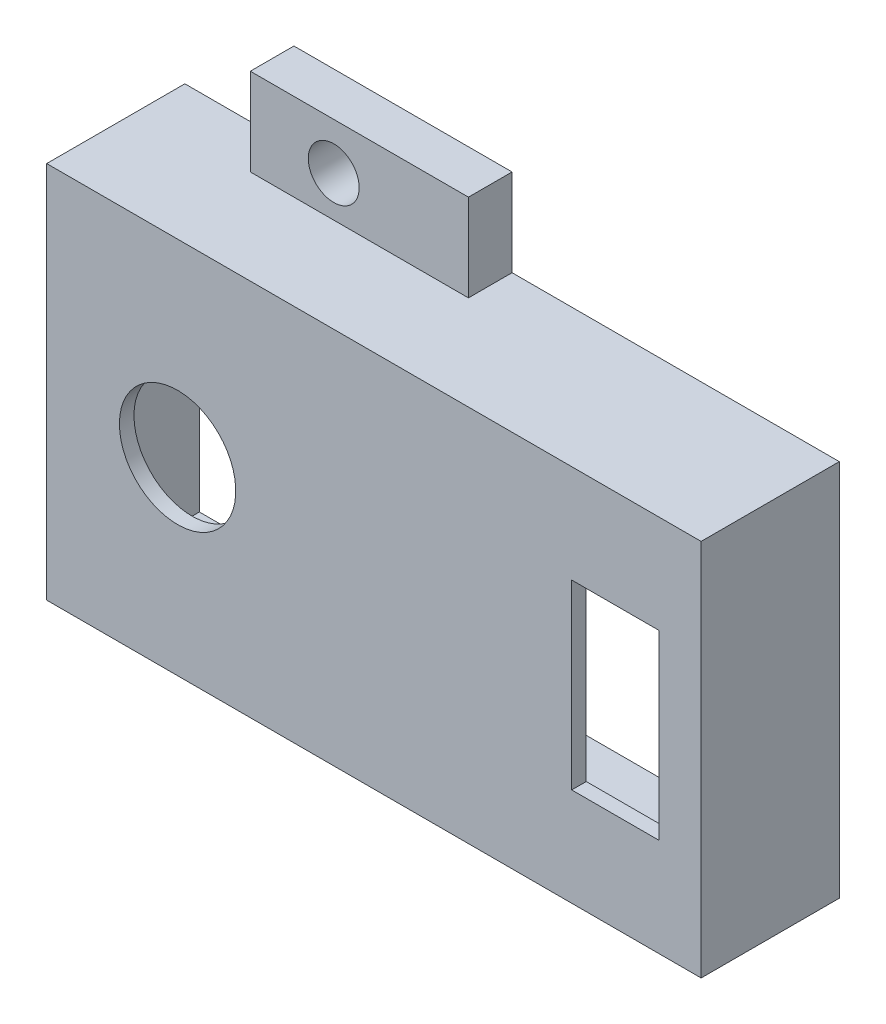
ISO-10303-21;
HEADER;
FILE_DESCRIPTION(('STEP AP214'),'2;1');
FILE_NAME('part.step','',(''),(''),'','','');
FILE_SCHEMA(('AUTOMOTIVE_DESIGN { 1 0 10303 214 1 1 1 1 }'));
ENDSEC;
DATA;
#1=APPLICATION_CONTEXT('core data for automotive mechanical design processes');
#2=APPLICATION_PROTOCOL_DEFINITION('international standard','automotive_design',2000,#1);
#3=PRODUCT_CONTEXT('',#1,'mechanical');
#4=PRODUCT('Part','Part','',(#3));
#5=PRODUCT_RELATED_PRODUCT_CATEGORY('part','',(#4));
#6=PRODUCT_DEFINITION_FORMATION('','',#4);
#7=PRODUCT_DEFINITION_CONTEXT('part definition',#1,'design');
#8=PRODUCT_DEFINITION('design','',#6,#7);
#9=PRODUCT_DEFINITION_SHAPE('','',#8);
#10=(LENGTH_UNIT() NAMED_UNIT(*) SI_UNIT(.MILLI.,.METRE.));
#11=(NAMED_UNIT(*) PLANE_ANGLE_UNIT() SI_UNIT($,.RADIAN.));
#12=(NAMED_UNIT(*) SI_UNIT($,.STERADIAN.) SOLID_ANGLE_UNIT());
#13=UNCERTAINTY_MEASURE_WITH_UNIT(LENGTH_MEASURE(1.E-05),#10,'distance_accuracy_value','');
#14=(GEOMETRIC_REPRESENTATION_CONTEXT(3) GLOBAL_UNCERTAINTY_ASSIGNED_CONTEXT((#13)) GLOBAL_UNIT_ASSIGNED_CONTEXT((#10,
#11,#12)) REPRESENTATION_CONTEXT('',''));
#15=CARTESIAN_POINT('',(0.,0.,0.));
#16=DIRECTION('',(0.,0.,1.));
#17=DIRECTION('',(1.,0.,0.));
#18=AXIS2_PLACEMENT_3D('',#15,#16,#17);
#19=CARTESIAN_POINT('',(-22.5,-13.,9.5));
#20=DIRECTION('',(0.,1.,0.));
#21=DIRECTION('',(0.,0.,1.));
#22=AXIS2_PLACEMENT_3D('',#19,#20,#21);
#23=PLANE('',#22);
#24=DIRECTION('',(0.,0.,-1.));
#25=VECTOR('',#24,1.);
#26=CARTESIAN_POINT('',(-15.,-13.,3.));
#27=LINE('',#26,#25);
#28=CARTESIAN_POINT('',(-15.,-13.,3.));
#29=VERTEX_POINT('',#28);
#30=CARTESIAN_POINT('',(-15.,-13.,0.));
#31=VERTEX_POINT('',#30);
#32=EDGE_CURVE('E220',#29,#31,#27,.T.);
#33=ORIENTED_EDGE('',*,*,#32,.F.);
#34=DIRECTION('',(1.,0.,0.));
#35=VECTOR('',#34,1.);
#36=CARTESIAN_POINT('',(0.,-13.,3.));
#37=LINE('',#36,#35);
#38=CARTESIAN_POINT('',(0.,-13.,3.));
#39=VERTEX_POINT('',#38);
#40=EDGE_CURVE('E185',#29,#39,#37,.T.);
#41=ORIENTED_EDGE('',*,*,#40,.T.);
#42=DIRECTION('',(0.,0.,-1.));
#43=VECTOR('',#42,1.);
#44=CARTESIAN_POINT('',(0.,-13.,3.));
#45=LINE('',#44,#43);
#46=CARTESIAN_POINT('',(0.,-13.,0.));
#47=VERTEX_POINT('',#46);
#48=EDGE_CURVE('E198',#39,#47,#45,.T.);
#49=ORIENTED_EDGE('',*,*,#48,.T.);
#50=DIRECTION('',(1.,0.,0.));
#51=VECTOR('',#50,1.);
#52=CARTESIAN_POINT('',(-22.5,-13.,0.));
#53=LINE('',#52,#51);
#54=CARTESIAN_POINT('',(22.5,-13.,0.));
#55=VERTEX_POINT('',#54);
#56=EDGE_CURVE('E384',#47,#55,#53,.T.);
#57=ORIENTED_EDGE('',*,*,#56,.T.);
#58=DIRECTION('',(0.,0.,-1.));
#59=VECTOR('',#58,1.);
#60=CARTESIAN_POINT('',(22.5,-13.,9.5));
#61=LINE('',#60,#59);
#62=CARTESIAN_POINT('',(22.5,-13.,9.5));
#63=VERTEX_POINT('',#62);
#64=EDGE_CURVE('E372',#63,#55,#61,.T.);
#65=ORIENTED_EDGE('',*,*,#64,.F.);
#66=DIRECTION('',(1.,0.,0.));
#67=VECTOR('',#66,1.);
#68=CARTESIAN_POINT('',(-22.5,-13.,9.5));
#69=LINE('',#68,#67);
#70=CARTESIAN_POINT('',(-22.5,-13.,9.5));
#71=VERTEX_POINT('',#70);
#72=EDGE_CURVE('E369',#71,#63,#69,.T.);
#73=ORIENTED_EDGE('',*,*,#72,.F.);
#74=DIRECTION('',(0.,0.,-1.));
#75=VECTOR('',#74,1.);
#76=CARTESIAN_POINT('',(-22.5,-13.,9.5));
#77=LINE('',#76,#75);
#78=CARTESIAN_POINT('',(-22.5,-13.,0.));
#79=VERTEX_POINT('',#78);
#80=EDGE_CURVE('E391',#71,#79,#77,.T.);
#81=ORIENTED_EDGE('',*,*,#80,.T.);
#82=EDGE_CURVE('E363',#79,#31,#53,.T.);
#83=ORIENTED_EDGE('',*,*,#82,.T.);
#84=EDGE_LOOP('',(#33,#41,#49,#57,#65,#73,#81,#83));
#85=FACE_BOUND('',#84,.T.);
#86=ADVANCED_FACE('F38',(#85),#23,.F.);
#87=CARTESIAN_POINT('',(-22.5,13.,9.5));
#88=DIRECTION('',(0.,-1.,0.));
#89=DIRECTION('',(0.,0.,-1.));
#90=AXIS2_PLACEMENT_3D('',#87,#88,#89);
#91=PLANE('',#90);
#92=DIRECTION('',(0.,0.,-1.));
#93=VECTOR('',#92,1.);
#94=CARTESIAN_POINT('',(0.,13.,3.));
#95=LINE('',#94,#93);
#96=CARTESIAN_POINT('',(0.,13.,3.));
#97=VERTEX_POINT('',#96);
#98=CARTESIAN_POINT('',(0.,13.,0.));
#99=VERTEX_POINT('',#98);
#100=EDGE_CURVE('E242',#97,#99,#95,.T.);
#101=ORIENTED_EDGE('',*,*,#100,.F.);
#102=DIRECTION('',(-1.,0.,0.));
#103=VECTOR('',#102,1.);
#104=CARTESIAN_POINT('',(0.,13.,3.));
#105=LINE('',#104,#103);
#106=CARTESIAN_POINT('',(-15.,13.,3.));
#107=VERTEX_POINT('',#106);
#108=EDGE_CURVE('E229',#97,#107,#105,.T.);
#109=ORIENTED_EDGE('',*,*,#108,.T.);
#110=DIRECTION('',(0.,0.,-1.));
#111=VECTOR('',#110,1.);
#112=CARTESIAN_POINT('',(-15.,13.,3.));
#113=LINE('',#112,#111);
#114=CARTESIAN_POINT('',(-15.,13.,0.));
#115=VERTEX_POINT('',#114);
#116=EDGE_CURVE('E258',#107,#115,#113,.T.);
#117=ORIENTED_EDGE('',*,*,#116,.T.);
#118=DIRECTION('',(-1.,0.,0.));
#119=VECTOR('',#118,1.);
#120=CARTESIAN_POINT('',(-22.5,13.,0.));
#121=LINE('',#120,#119);
#122=CARTESIAN_POINT('',(-22.5,13.,0.));
#123=VERTEX_POINT('',#122);
#124=EDGE_CURVE('E376',#115,#123,#121,.T.);
#125=ORIENTED_EDGE('',*,*,#124,.T.);
#126=DIRECTION('',(0.,0.,-1.));
#127=VECTOR('',#126,1.);
#128=CARTESIAN_POINT('',(-22.5,13.,9.5));
#129=LINE('',#128,#127);
#130=CARTESIAN_POINT('',(-22.5,13.,9.5));
#131=VERTEX_POINT('',#130);
#132=EDGE_CURVE('E47',#131,#123,#129,.T.);
#133=ORIENTED_EDGE('',*,*,#132,.F.);
#134=DIRECTION('',(-1.,0.,0.));
#135=VECTOR('',#134,1.);
#136=CARTESIAN_POINT('',(-22.5,13.,9.5));
#137=LINE('',#136,#135);
#138=CARTESIAN_POINT('',(22.5,13.,9.5));
#139=VERTEX_POINT('',#138);
#140=EDGE_CURVE('E362',#139,#131,#137,.T.);
#141=ORIENTED_EDGE('',*,*,#140,.F.);
#142=DIRECTION('',(0.,0.,-1.));
#143=VECTOR('',#142,1.);
#144=CARTESIAN_POINT('',(22.5,13.,9.5));
#145=LINE('',#144,#143);
#146=CARTESIAN_POINT('',(22.5,13.,0.));
#147=VERTEX_POINT('',#146);
#148=EDGE_CURVE('E11',#139,#147,#145,.T.);
#149=ORIENTED_EDGE('',*,*,#148,.T.);
#150=EDGE_CURVE('E377',#147,#99,#121,.T.);
#151=ORIENTED_EDGE('',*,*,#150,.T.);
#152=EDGE_LOOP('',(#101,#109,#117,#125,#133,#141,#149,#151));
#153=FACE_BOUND('',#152,.T.);
#154=ADVANCED_FACE('F419',(#153),#91,.F.);
#155=CARTESIAN_POINT('',(0.,0.,0.));
#156=DIRECTION('',(0.,0.,-1.));
#157=DIRECTION('',(-1.,0.,0.));
#158=AXIS2_PLACEMENT_3D('',#155,#156,#157);
#159=PLANE('',#158);
#160=CARTESIAN_POINT('',(-9.26271023683527,15.798173241126,0.));
#161=DIRECTION('',(0.,0.,-1.));
#162=DIRECTION('',(-1.,0.,0.));
#163=AXIS2_PLACEMENT_3D('',#160,#161,#162);
#164=CIRCLE('',#163,1.75);
#165=CARTESIAN_POINT('',(-11.0127102368353,15.798173241126,0.));
#166=VERTEX_POINT('',#165);
#167=EDGE_CURVE('E470',#166,#166,#164,.T.);
#168=ORIENTED_EDGE('',*,*,#167,.F.);
#169=EDGE_LOOP('',(#168));
#170=FACE_BOUND('',#169,.T.);
#171=CARTESIAN_POINT('',(-8.67425342470182,-16.2125602113306,0.));
#172=DIRECTION('',(0.,0.,-1.));
#173=DIRECTION('',(-1.,0.,0.));
#174=AXIS2_PLACEMENT_3D('',#171,#172,#173);
#175=CIRCLE('',#174,1.6);
#176=CARTESIAN_POINT('',(-10.2742534247018,-16.2125602113306,0.));
#177=VERTEX_POINT('',#176);
#178=EDGE_CURVE('E206',#177,#177,#175,.T.);
#179=ORIENTED_EDGE('',*,*,#178,.F.);
#180=EDGE_LOOP('',(#179));
#181=FACE_BOUND('',#180,.T.);
#182=DIRECTION('',(0.,1.,0.));
#183=VECTOR('',#182,1.);
#184=CARTESIAN_POINT('',(22.5,-13.,0.));
#185=LINE('',#184,#183);
#186=EDGE_CURVE('E319',#55,#147,#185,.T.);
#187=ORIENTED_EDGE('',*,*,#186,.F.);
#188=ORIENTED_EDGE('',*,*,#56,.F.);
#189=DIRECTION('',(0.,-1.,0.));
#190=VECTOR('',#189,1.);
#191=CARTESIAN_POINT('',(0.,-13.,0.));
#192=LINE('',#191,#190);
#193=CARTESIAN_POINT('',(0.,-19.,0.));
#194=VERTEX_POINT('',#193);
#195=EDGE_CURVE('E54',#47,#194,#192,.T.);
#196=ORIENTED_EDGE('',*,*,#195,.T.);
#197=DIRECTION('',(-1.,0.,0.));
#198=VECTOR('',#197,1.);
#199=CARTESIAN_POINT('',(0.,-19.,0.));
#200=LINE('',#199,#198);
#201=CARTESIAN_POINT('',(-15.,-19.,0.));
#202=VERTEX_POINT('',#201);
#203=EDGE_CURVE('E181',#194,#202,#200,.T.);
#204=ORIENTED_EDGE('',*,*,#203,.T.);
#205=DIRECTION('',(0.,1.,0.));
#206=VECTOR('',#205,1.);
#207=CARTESIAN_POINT('',(-15.,-13.,0.));
#208=LINE('',#207,#206);
#209=EDGE_CURVE('E200',#202,#31,#208,.T.);
#210=ORIENTED_EDGE('',*,*,#209,.T.);
#211=ORIENTED_EDGE('',*,*,#82,.F.);
#212=DIRECTION('',(0.,-1.,0.));
#213=VECTOR('',#212,1.);
#214=CARTESIAN_POINT('',(-22.5,-13.,0.));
#215=LINE('',#214,#213);
#216=EDGE_CURVE('E381',#123,#79,#215,.T.);
#217=ORIENTED_EDGE('',*,*,#216,.F.);
#218=ORIENTED_EDGE('',*,*,#124,.F.);
#219=DIRECTION('',(0.,1.,0.));
#220=VECTOR('',#219,1.);
#221=CARTESIAN_POINT('',(-15.,13.,0.));
#222=LINE('',#221,#220);
#223=CARTESIAN_POINT('',(-15.,19.,0.));
#224=VERTEX_POINT('',#223);
#225=EDGE_CURVE('E62',#115,#224,#222,.T.);
#226=ORIENTED_EDGE('',*,*,#225,.T.);
#227=DIRECTION('',(1.,0.,0.));
#228=VECTOR('',#227,1.);
#229=CARTESIAN_POINT('',(0.,19.,0.));
#230=LINE('',#229,#228);
#231=CARTESIAN_POINT('',(0.,19.,0.));
#232=VERTEX_POINT('',#231);
#233=EDGE_CURVE('E230',#224,#232,#230,.T.);
#234=ORIENTED_EDGE('',*,*,#233,.T.);
#235=DIRECTION('',(0.,-1.,0.));
#236=VECTOR('',#235,1.);
#237=CARTESIAN_POINT('',(0.,13.,0.));
#238=LINE('',#237,#236);
#239=EDGE_CURVE('E219',#232,#99,#238,.T.);
#240=ORIENTED_EDGE('',*,*,#239,.T.);
#241=ORIENTED_EDGE('',*,*,#150,.F.);
#242=EDGE_LOOP('',(#187,#188,#196,#204,#210,#211,#217,#218,#226,#234,#240,#241));
#243=FACE_BOUND('',#242,.T.);
#244=DIRECTION('',(1.,0.,0.));
#245=VECTOR('',#244,1.);
#246=CARTESIAN_POINT('',(0.,-12.,0.));
#247=LINE('',#246,#245);
#248=CARTESIAN_POINT('',(-21.5,-12.,0.));
#249=VERTEX_POINT('',#248);
#250=CARTESIAN_POINT('',(21.5,-12.,0.));
#251=VERTEX_POINT('',#250);
#252=EDGE_CURVE('E326',#249,#251,#247,.T.);
#253=ORIENTED_EDGE('',*,*,#252,.T.);
#254=DIRECTION('',(0.,1.,0.));
#255=VECTOR('',#254,1.);
#256=CARTESIAN_POINT('',(21.5,0.,0.));
#257=LINE('',#256,#255);
#258=CARTESIAN_POINT('',(21.5,12.,0.));
#259=VERTEX_POINT('',#258);
#260=EDGE_CURVE('E314',#251,#259,#257,.T.);
#261=ORIENTED_EDGE('',*,*,#260,.T.);
#262=DIRECTION('',(-1.,0.,0.));
#263=VECTOR('',#262,1.);
#264=CARTESIAN_POINT('',(0.,12.,0.));
#265=LINE('',#264,#263);
#266=CARTESIAN_POINT('',(-21.5,12.,0.));
#267=VERTEX_POINT('',#266);
#268=EDGE_CURVE('E347',#259,#267,#265,.T.);
#269=ORIENTED_EDGE('',*,*,#268,.T.);
#270=DIRECTION('',(0.,-1.,0.));
#271=VECTOR('',#270,1.);
#272=CARTESIAN_POINT('',(-21.5,0.,0.));
#273=LINE('',#272,#271);
#274=EDGE_CURVE('E351',#267,#249,#273,.T.);
#275=ORIENTED_EDGE('',*,*,#274,.T.);
#276=EDGE_LOOP('',(#253,#261,#269,#275));
#277=FACE_BOUND('',#276,.T.);
#278=ADVANCED_FACE('F407',(#170,#181,#243,#277),#159,.T.);
#279=CARTESIAN_POINT('',(22.5,-13.,9.5));
#280=DIRECTION('',(-1.,0.,0.));
#281=DIRECTION('',(0.,0.,1.));
#282=AXIS2_PLACEMENT_3D('',#279,#280,#281);
#283=PLANE('',#282);
#284=ORIENTED_EDGE('',*,*,#186,.T.);
#285=ORIENTED_EDGE('',*,*,#148,.F.);
#286=DIRECTION('',(0.,1.,0.));
#287=VECTOR('',#286,1.);
#288=CARTESIAN_POINT('',(22.5,-13.,9.5));
#289=LINE('',#288,#287);
#290=EDGE_CURVE('E358',#63,#139,#289,.T.);
#291=ORIENTED_EDGE('',*,*,#290,.F.);
#292=ORIENTED_EDGE('',*,*,#64,.T.);
#293=EDGE_LOOP('',(#284,#285,#291,#292));
#294=FACE_BOUND('',#293,.T.);
#295=ADVANCED_FACE('F40',(#294),#283,.F.);
#296=CARTESIAN_POINT('',(-22.5,-13.,9.5));
#297=DIRECTION('',(1.,0.,0.));
#298=DIRECTION('',(0.,0.,-1.));
#299=AXIS2_PLACEMENT_3D('',#296,#297,#298);
#300=PLANE('',#299);
#301=ORIENTED_EDGE('',*,*,#216,.T.);
#302=ORIENTED_EDGE('',*,*,#80,.F.);
#303=DIRECTION('',(0.,-1.,0.));
#304=VECTOR('',#303,1.);
#305=CARTESIAN_POINT('',(-22.5,-13.,9.5));
#306=LINE('',#305,#304);
#307=EDGE_CURVE('E366',#131,#71,#306,.T.);
#308=ORIENTED_EDGE('',*,*,#307,.F.);
#309=ORIENTED_EDGE('',*,*,#132,.T.);
#310=EDGE_LOOP('',(#301,#302,#308,#309));
#311=FACE_BOUND('',#310,.T.);
#312=ADVANCED_FACE('F400',(#311),#300,.F.);
#313=CARTESIAN_POINT('',(0.,0.,9.5));
#314=DIRECTION('',(0.,0.,-1.));
#315=DIRECTION('',(-1.,0.,0.));
#316=AXIS2_PLACEMENT_3D('',#313,#314,#315);
#317=PLANE('',#316);
#318=CARTESIAN_POINT('',(-13.5,0.,9.5));
#319=DIRECTION('',(0.,0.,-1.));
#320=DIRECTION('',(-1.,0.,0.));
#321=AXIS2_PLACEMENT_3D('',#318,#319,#320);
#322=CIRCLE('',#321,4.);
#323=CARTESIAN_POINT('',(-17.5,0.,9.5));
#324=VERTEX_POINT('',#323);
#325=EDGE_CURVE('E310',#324,#324,#322,.T.);
#326=ORIENTED_EDGE('',*,*,#325,.T.);
#327=EDGE_LOOP('',(#326));
#328=FACE_BOUND('',#327,.T.);
#329=DIRECTION('',(1.,0.,0.));
#330=VECTOR('',#329,1.);
#331=CARTESIAN_POINT('',(0.,6.25,9.5));
#332=LINE('',#331,#330);
#333=CARTESIAN_POINT('',(13.6,6.25,9.5));
#334=VERTEX_POINT('',#333);
#335=CARTESIAN_POINT('',(19.6,6.25,9.5));
#336=VERTEX_POINT('',#335);
#337=EDGE_CURVE('E302',#334,#336,#332,.T.);
#338=ORIENTED_EDGE('',*,*,#337,.T.);
#339=DIRECTION('',(0.,-1.,0.));
#340=VECTOR('',#339,1.);
#341=CARTESIAN_POINT('',(19.6,0.,9.5));
#342=LINE('',#341,#340);
#343=CARTESIAN_POINT('',(19.6,-6.25,9.5));
#344=VERTEX_POINT('',#343);
#345=EDGE_CURVE('E306',#336,#344,#342,.T.);
#346=ORIENTED_EDGE('',*,*,#345,.T.);
#347=DIRECTION('',(-1.,0.,0.));
#348=VECTOR('',#347,1.);
#349=CARTESIAN_POINT('',(0.,-6.25,9.5));
#350=LINE('',#349,#348);
#351=CARTESIAN_POINT('',(13.6,-6.25,9.5));
#352=VERTEX_POINT('',#351);
#353=EDGE_CURVE('E267',#344,#352,#350,.T.);
#354=ORIENTED_EDGE('',*,*,#353,.T.);
#355=DIRECTION('',(0.,1.,0.));
#356=VECTOR('',#355,1.);
#357=CARTESIAN_POINT('',(13.6,0.,9.5));
#358=LINE('',#357,#356);
#359=EDGE_CURVE('E298',#352,#334,#358,.T.);
#360=ORIENTED_EDGE('',*,*,#359,.T.);
#361=EDGE_LOOP('',(#338,#346,#354,#360));
#362=FACE_BOUND('',#361,.T.);
#363=ORIENTED_EDGE('',*,*,#290,.T.);
#364=ORIENTED_EDGE('',*,*,#140,.T.);
#365=ORIENTED_EDGE('',*,*,#307,.T.);
#366=ORIENTED_EDGE('',*,*,#72,.T.);
#367=EDGE_LOOP('',(#363,#364,#365,#366));
#368=FACE_BOUND('',#367,.T.);
#369=ADVANCED_FACE('F416',(#328,#362,#368),#317,.F.);
#370=CARTESIAN_POINT('',(21.5,-13.,9.5));
#371=DIRECTION('',(-1.,0.,0.));
#372=DIRECTION('',(0.,0.,1.));
#373=AXIS2_PLACEMENT_3D('',#370,#371,#372);
#374=PLANE('',#373);
#375=ORIENTED_EDGE('',*,*,#260,.F.);
#376=DIRECTION('',(0.,0.,-1.));
#377=VECTOR('',#376,1.);
#378=CARTESIAN_POINT('',(21.5,-12.,9.5));
#379=LINE('',#378,#377);
#380=CARTESIAN_POINT('',(21.5,-12.,8.5));
#381=VERTEX_POINT('',#380);
#382=EDGE_CURVE('E327',#381,#251,#379,.T.);
#383=ORIENTED_EDGE('',*,*,#382,.F.);
#384=DIRECTION('',(0.,1.,0.));
#385=VECTOR('',#384,1.);
#386=CARTESIAN_POINT('',(21.5,0.,8.5));
#387=LINE('',#386,#385);
#388=CARTESIAN_POINT('',(21.5,12.,8.5));
#389=VERTEX_POINT('',#388);
#390=EDGE_CURVE('E321',#381,#389,#387,.T.);
#391=ORIENTED_EDGE('',*,*,#390,.T.);
#392=DIRECTION('',(0.,0.,-1.));
#393=VECTOR('',#392,1.);
#394=CARTESIAN_POINT('',(21.5,12.,9.5));
#395=LINE('',#394,#393);
#396=EDGE_CURVE('E315',#389,#259,#395,.T.);
#397=ORIENTED_EDGE('',*,*,#396,.T.);
#398=EDGE_LOOP('',(#375,#383,#391,#397));
#399=FACE_BOUND('',#398,.T.);
#400=ADVANCED_FACE('F457',(#399),#374,.T.);
#401=CARTESIAN_POINT('',(-22.5,12.,9.5));
#402=DIRECTION('',(0.,-1.,0.));
#403=DIRECTION('',(0.,0.,-1.));
#404=AXIS2_PLACEMENT_3D('',#401,#402,#403);
#405=PLANE('',#404);
#406=ORIENTED_EDGE('',*,*,#268,.F.);
#407=ORIENTED_EDGE('',*,*,#396,.F.);
#408=DIRECTION('',(-1.,0.,0.));
#409=VECTOR('',#408,1.);
#410=CARTESIAN_POINT('',(0.,12.,8.5));
#411=LINE('',#410,#409);
#412=CARTESIAN_POINT('',(-21.5,12.,8.5));
#413=VERTEX_POINT('',#412);
#414=EDGE_CURVE('E325',#389,#413,#411,.T.);
#415=ORIENTED_EDGE('',*,*,#414,.T.);
#416=DIRECTION('',(0.,0.,-1.));
#417=VECTOR('',#416,1.);
#418=CARTESIAN_POINT('',(-21.5,12.,9.5));
#419=LINE('',#418,#417);
#420=EDGE_CURVE('E320',#413,#267,#419,.T.);
#421=ORIENTED_EDGE('',*,*,#420,.T.);
#422=EDGE_LOOP('',(#406,#407,#415,#421));
#423=FACE_BOUND('',#422,.T.);
#424=ADVANCED_FACE('F650',(#423),#405,.T.);
#425=CARTESIAN_POINT('',(-21.5,-13.,9.5));
#426=DIRECTION('',(1.,0.,0.));
#427=DIRECTION('',(0.,0.,-1.));
#428=AXIS2_PLACEMENT_3D('',#425,#426,#427);
#429=PLANE('',#428);
#430=ORIENTED_EDGE('',*,*,#274,.F.);
#431=ORIENTED_EDGE('',*,*,#420,.F.);
#432=DIRECTION('',(0.,-1.,0.));
#433=VECTOR('',#432,1.);
#434=CARTESIAN_POINT('',(-21.5,0.,8.5));
#435=LINE('',#434,#433);
#436=CARTESIAN_POINT('',(-21.5,-12.,8.5));
#437=VERTEX_POINT('',#436);
#438=EDGE_CURVE('E337',#413,#437,#435,.T.);
#439=ORIENTED_EDGE('',*,*,#438,.T.);
#440=DIRECTION('',(0.,0.,-1.));
#441=VECTOR('',#440,1.);
#442=CARTESIAN_POINT('',(-21.5,-12.,9.5));
#443=LINE('',#442,#441);
#444=EDGE_CURVE('E330',#437,#249,#443,.T.);
#445=ORIENTED_EDGE('',*,*,#444,.T.);
#446=EDGE_LOOP('',(#430,#431,#439,#445));
#447=FACE_BOUND('',#446,.T.);
#448=ADVANCED_FACE('F640',(#447),#429,.T.);
#449=CARTESIAN_POINT('',(-22.5,-12.,9.5));
#450=DIRECTION('',(0.,1.,0.));
#451=DIRECTION('',(0.,0.,1.));
#452=AXIS2_PLACEMENT_3D('',#449,#450,#451);
#453=PLANE('',#452);
#454=ORIENTED_EDGE('',*,*,#252,.F.);
#455=ORIENTED_EDGE('',*,*,#444,.F.);
#456=DIRECTION('',(1.,0.,0.));
#457=VECTOR('',#456,1.);
#458=CARTESIAN_POINT('',(0.,-12.,8.5));
#459=LINE('',#458,#457);
#460=EDGE_CURVE('E331',#437,#381,#459,.T.);
#461=ORIENTED_EDGE('',*,*,#460,.T.);
#462=ORIENTED_EDGE('',*,*,#382,.T.);
#463=EDGE_LOOP('',(#454,#455,#461,#462));
#464=FACE_BOUND('',#463,.T.);
#465=ADVANCED_FACE('F621',(#464),#453,.T.);
#466=CARTESIAN_POINT('',(0.,0.,8.5));
#467=DIRECTION('',(0.,0.,-1.));
#468=DIRECTION('',(-1.,0.,0.));
#469=AXIS2_PLACEMENT_3D('',#466,#467,#468);
#470=PLANE('',#469);
#471=CARTESIAN_POINT('',(-13.5,0.,8.5));
#472=DIRECTION('',(0.,0.,-1.));
#473=DIRECTION('',(-1.,0.,0.));
#474=AXIS2_PLACEMENT_3D('',#471,#472,#473);
#475=CIRCLE('',#474,4.);
#476=CARTESIAN_POINT('',(-17.5,0.,8.5));
#477=VERTEX_POINT('',#476);
#478=EDGE_CURVE('E263',#477,#477,#475,.T.);
#479=ORIENTED_EDGE('',*,*,#478,.F.);
#480=EDGE_LOOP('',(#479));
#481=FACE_BOUND('',#480,.T.);
#482=DIRECTION('',(0.,-1.,0.));
#483=VECTOR('',#482,1.);
#484=CARTESIAN_POINT('',(19.6,-6.25,8.5));
#485=LINE('',#484,#483);
#486=CARTESIAN_POINT('',(19.6,6.25,8.5));
#487=VERTEX_POINT('',#486);
#488=CARTESIAN_POINT('',(19.6,-6.25,8.5));
#489=VERTEX_POINT('',#488);
#490=EDGE_CURVE('E254',#487,#489,#485,.T.);
#491=ORIENTED_EDGE('',*,*,#490,.F.);
#492=DIRECTION('',(1.,0.,0.));
#493=VECTOR('',#492,1.);
#494=CARTESIAN_POINT('',(13.6,6.25,8.5));
#495=LINE('',#494,#493);
#496=CARTESIAN_POINT('',(13.6,6.25,8.5));
#497=VERTEX_POINT('',#496);
#498=EDGE_CURVE('E279',#497,#487,#495,.T.);
#499=ORIENTED_EDGE('',*,*,#498,.F.);
#500=DIRECTION('',(0.,1.,0.));
#501=VECTOR('',#500,1.);
#502=CARTESIAN_POINT('',(13.6,-6.25,8.5));
#503=LINE('',#502,#501);
#504=CARTESIAN_POINT('',(13.6,-6.25,8.5));
#505=VERTEX_POINT('',#504);
#506=EDGE_CURVE('E275',#505,#497,#503,.T.);
#507=ORIENTED_EDGE('',*,*,#506,.F.);
#508=DIRECTION('',(-1.,0.,0.));
#509=VECTOR('',#508,1.);
#510=CARTESIAN_POINT('',(13.6,-6.25,8.5));
#511=LINE('',#510,#509);
#512=EDGE_CURVE('E271',#489,#505,#511,.T.);
#513=ORIENTED_EDGE('',*,*,#512,.F.);
#514=EDGE_LOOP('',(#491,#499,#507,#513));
#515=FACE_BOUND('',#514,.T.);
#516=ORIENTED_EDGE('',*,*,#390,.F.);
#517=ORIENTED_EDGE('',*,*,#460,.F.);
#518=ORIENTED_EDGE('',*,*,#438,.F.);
#519=ORIENTED_EDGE('',*,*,#414,.F.);
#520=EDGE_LOOP('',(#516,#517,#518,#519));
#521=FACE_BOUND('',#520,.T.);
#522=ADVANCED_FACE('F611',(#481,#515,#521),#470,.T.);
#523=CARTESIAN_POINT('',(19.6,-6.25,18.));
#524=DIRECTION('',(1.,0.,0.));
#525=DIRECTION('',(0.,0.,-1.));
#526=AXIS2_PLACEMENT_3D('',#523,#524,#525);
#527=PLANE('',#526);
#528=DIRECTION('',(0.,0.,-1.));
#529=VECTOR('',#528,1.);
#530=CARTESIAN_POINT('',(19.6,6.25,18.));
#531=LINE('',#530,#529);
#532=EDGE_CURVE('E268',#336,#487,#531,.T.);
#533=ORIENTED_EDGE('',*,*,#532,.T.);
#534=ORIENTED_EDGE('',*,*,#490,.T.);
#535=DIRECTION('',(0.,0.,-1.));
#536=VECTOR('',#535,1.);
#537=CARTESIAN_POINT('',(19.6,-6.25,18.));
#538=LINE('',#537,#536);
#539=EDGE_CURVE('E283',#344,#489,#538,.T.);
#540=ORIENTED_EDGE('',*,*,#539,.F.);
#541=ORIENTED_EDGE('',*,*,#345,.F.);
#542=EDGE_LOOP('',(#533,#534,#540,#541));
#543=FACE_BOUND('',#542,.T.);
#544=ADVANCED_FACE('F601',(#543),#527,.F.);
#545=CARTESIAN_POINT('',(13.6,6.25,18.));
#546=DIRECTION('',(0.,1.,0.));
#547=DIRECTION('',(-1.,0.,0.));
#548=AXIS2_PLACEMENT_3D('',#545,#546,#547);
#549=PLANE('',#548);
#550=DIRECTION('',(0.,0.,-1.));
#551=VECTOR('',#550,1.);
#552=CARTESIAN_POINT('',(13.6,6.25,18.));
#553=LINE('',#552,#551);
#554=EDGE_CURVE('E286',#334,#497,#553,.T.);
#555=ORIENTED_EDGE('',*,*,#554,.T.);
#556=ORIENTED_EDGE('',*,*,#498,.T.);
#557=ORIENTED_EDGE('',*,*,#532,.F.);
#558=ORIENTED_EDGE('',*,*,#337,.F.);
#559=EDGE_LOOP('',(#555,#556,#557,#558));
#560=FACE_BOUND('',#559,.T.);
#561=ADVANCED_FACE('F591',(#560),#549,.F.);
#562=CARTESIAN_POINT('',(13.6,-6.25,18.));
#563=DIRECTION('',(-1.,0.,0.));
#564=DIRECTION('',(0.,-1.,0.));
#565=AXIS2_PLACEMENT_3D('',#562,#563,#564);
#566=PLANE('',#565);
#567=DIRECTION('',(0.,0.,-1.));
#568=VECTOR('',#567,1.);
#569=CARTESIAN_POINT('',(13.6,-6.25,18.));
#570=LINE('',#569,#568);
#571=EDGE_CURVE('E289',#352,#505,#570,.T.);
#572=ORIENTED_EDGE('',*,*,#571,.T.);
#573=ORIENTED_EDGE('',*,*,#506,.T.);
#574=ORIENTED_EDGE('',*,*,#554,.F.);
#575=ORIENTED_EDGE('',*,*,#359,.F.);
#576=EDGE_LOOP('',(#572,#573,#574,#575));
#577=FACE_BOUND('',#576,.T.);
#578=ADVANCED_FACE('F581',(#577),#566,.F.);
#579=CARTESIAN_POINT('',(13.6,-6.25,18.));
#580=DIRECTION('',(0.,-1.,0.));
#581=DIRECTION('',(1.,0.,0.));
#582=AXIS2_PLACEMENT_3D('',#579,#580,#581);
#583=PLANE('',#582);
#584=ORIENTED_EDGE('',*,*,#539,.T.);
#585=ORIENTED_EDGE('',*,*,#512,.T.);
#586=ORIENTED_EDGE('',*,*,#571,.F.);
#587=ORIENTED_EDGE('',*,*,#353,.F.);
#588=EDGE_LOOP('',(#584,#585,#586,#587));
#589=FACE_BOUND('',#588,.T.);
#590=ADVANCED_FACE('F571',(#589),#583,.F.);
#591=CARTESIAN_POINT('',(-13.5,0.,18.));
#592=DIRECTION('',(0.,0.,-1.));
#593=DIRECTION('',(-1.,0.,0.));
#594=AXIS2_PLACEMENT_3D('',#591,#592,#593);
#595=CYLINDRICAL_SURFACE('',#594,4.);
#596=ORIENTED_EDGE('',*,*,#478,.T.);
#597=EDGE_LOOP('',(#596));
#598=FACE_BOUND('',#597,.T.);
#599=ORIENTED_EDGE('',*,*,#325,.F.);
#600=EDGE_LOOP('',(#599));
#601=FACE_BOUND('',#600,.T.);
#602=ADVANCED_FACE('F441',(#598,#601),#595,.F.);
#603=CARTESIAN_POINT('',(0.,13.,3.));
#604=DIRECTION('',(1.,0.,0.));
#605=DIRECTION('',(0.,1.,0.));
#606=AXIS2_PLACEMENT_3D('',#603,#604,#605);
#607=PLANE('',#606);
#608=ORIENTED_EDGE('',*,*,#239,.F.);
#609=DIRECTION('',(0.,0.,-1.));
#610=VECTOR('',#609,1.);
#611=CARTESIAN_POINT('',(0.,19.,3.));
#612=LINE('',#611,#610);
#613=CARTESIAN_POINT('',(0.,19.,3.));
#614=VERTEX_POINT('',#613);
#615=EDGE_CURVE('E251',#614,#232,#612,.T.);
#616=ORIENTED_EDGE('',*,*,#615,.F.);
#617=DIRECTION('',(0.,-1.,0.));
#618=VECTOR('',#617,1.);
#619=CARTESIAN_POINT('',(0.,13.,3.));
#620=LINE('',#619,#618);
#621=EDGE_CURVE('E225',#614,#97,#620,.T.);
#622=ORIENTED_EDGE('',*,*,#621,.T.);
#623=ORIENTED_EDGE('',*,*,#100,.T.);
#624=EDGE_LOOP('',(#608,#616,#622,#623));
#625=FACE_BOUND('',#624,.T.);
#626=ADVANCED_FACE('F425',(#625),#607,.T.);
#627=CARTESIAN_POINT('',(0.,19.,3.));
#628=DIRECTION('',(0.,1.,0.));
#629=DIRECTION('',(0.,0.,1.));
#630=AXIS2_PLACEMENT_3D('',#627,#628,#629);
#631=PLANE('',#630);
#632=ORIENTED_EDGE('',*,*,#233,.F.);
#633=DIRECTION('',(0.,0.,-1.));
#634=VECTOR('',#633,1.);
#635=CARTESIAN_POINT('',(-15.,19.,3.));
#636=LINE('',#635,#634);
#637=CARTESIAN_POINT('',(-15.,19.,3.));
#638=VERTEX_POINT('',#637);
#639=EDGE_CURVE('E255',#638,#224,#636,.T.);
#640=ORIENTED_EDGE('',*,*,#639,.F.);
#641=DIRECTION('',(1.,0.,0.));
#642=VECTOR('',#641,1.);
#643=CARTESIAN_POINT('',(0.,19.,3.));
#644=LINE('',#643,#642);
#645=EDGE_CURVE('E238',#638,#614,#644,.T.);
#646=ORIENTED_EDGE('',*,*,#645,.T.);
#647=ORIENTED_EDGE('',*,*,#615,.T.);
#648=EDGE_LOOP('',(#632,#640,#646,#647));
#649=FACE_BOUND('',#648,.T.);
#650=ADVANCED_FACE('F433',(#649),#631,.T.);
#651=CARTESIAN_POINT('',(-15.,13.,3.));
#652=DIRECTION('',(-1.,0.,0.));
#653=DIRECTION('',(0.,0.,1.));
#654=AXIS2_PLACEMENT_3D('',#651,#652,#653);
#655=PLANE('',#654);
#656=ORIENTED_EDGE('',*,*,#225,.F.);
#657=ORIENTED_EDGE('',*,*,#116,.F.);
#658=DIRECTION('',(0.,1.,0.));
#659=VECTOR('',#658,1.);
#660=CARTESIAN_POINT('',(-15.,13.,3.));
#661=LINE('',#660,#659);
#662=EDGE_CURVE('E234',#107,#638,#661,.T.);
#663=ORIENTED_EDGE('',*,*,#662,.T.);
#664=ORIENTED_EDGE('',*,*,#639,.T.);
#665=EDGE_LOOP('',(#656,#657,#663,#664));
#666=FACE_BOUND('',#665,.T.);
#667=ADVANCED_FACE('F431',(#666),#655,.T.);
#668=CARTESIAN_POINT('',(0.,0.,3.));
#669=DIRECTION('',(0.,0.,1.));
#670=DIRECTION('',(1.,0.,0.));
#671=AXIS2_PLACEMENT_3D('',#668,#669,#670);
#672=PLANE('',#671);
#673=CARTESIAN_POINT('',(-9.26271023683527,15.798173241126,3.));
#674=DIRECTION('',(0.,0.,1.));
#675=DIRECTION('',(1.,0.,0.));
#676=AXIS2_PLACEMENT_3D('',#673,#674,#675);
#677=CIRCLE('',#676,1.75);
#678=CARTESIAN_POINT('',(-7.51271023683527,15.798173241126,3.));
#679=VERTEX_POINT('',#678);
#680=EDGE_CURVE('E481',#679,#679,#677,.T.);
#681=ORIENTED_EDGE('',*,*,#680,.F.);
#682=EDGE_LOOP('',(#681));
#683=FACE_BOUND('',#682,.T.);
#684=ORIENTED_EDGE('',*,*,#621,.F.);
#685=ORIENTED_EDGE('',*,*,#645,.F.);
#686=ORIENTED_EDGE('',*,*,#662,.F.);
#687=ORIENTED_EDGE('',*,*,#108,.F.);
#688=EDGE_LOOP('',(#684,#685,#686,#687));
#689=FACE_BOUND('',#688,.T.);
#690=ADVANCED_FACE('F429',(#683,#689),#672,.T.);
#691=CARTESIAN_POINT('',(0.,-13.,3.));
#692=DIRECTION('',(1.,0.,0.));
#693=DIRECTION('',(0.,1.,0.));
#694=AXIS2_PLACEMENT_3D('',#691,#692,#693);
#695=PLANE('',#694);
#696=ORIENTED_EDGE('',*,*,#195,.F.);
#697=ORIENTED_EDGE('',*,*,#48,.F.);
#698=DIRECTION('',(0.,-1.,0.));
#699=VECTOR('',#698,1.);
#700=CARTESIAN_POINT('',(0.,-13.,3.));
#701=LINE('',#700,#699);
#702=CARTESIAN_POINT('',(0.,-19.,3.));
#703=VERTEX_POINT('',#702);
#704=EDGE_CURVE('E192',#39,#703,#701,.T.);
#705=ORIENTED_EDGE('',*,*,#704,.T.);
#706=DIRECTION('',(0.,0.,-1.));
#707=VECTOR('',#706,1.);
#708=CARTESIAN_POINT('',(0.,-19.,3.));
#709=LINE('',#708,#707);
#710=EDGE_CURVE('E176',#703,#194,#709,.T.);
#711=ORIENTED_EDGE('',*,*,#710,.T.);
#712=EDGE_LOOP('',(#696,#697,#705,#711));
#713=FACE_BOUND('',#712,.T.);
#714=ADVANCED_FACE('F197',(#713),#695,.T.);
#715=CARTESIAN_POINT('',(-15.,-13.,3.));
#716=DIRECTION('',(-1.,0.,0.));
#717=DIRECTION('',(0.,0.,1.));
#718=AXIS2_PLACEMENT_3D('',#715,#716,#717);
#719=PLANE('',#718);
#720=ORIENTED_EDGE('',*,*,#209,.F.);
#721=DIRECTION('',(0.,0.,-1.));
#722=VECTOR('',#721,1.);
#723=CARTESIAN_POINT('',(-15.,-19.,3.));
#724=LINE('',#723,#722);
#725=CARTESIAN_POINT('',(-15.,-19.,3.));
#726=VERTEX_POINT('',#725);
#727=EDGE_CURVE('E184',#726,#202,#724,.T.);
#728=ORIENTED_EDGE('',*,*,#727,.F.);
#729=DIRECTION('',(0.,1.,0.));
#730=VECTOR('',#729,1.);
#731=CARTESIAN_POINT('',(-15.,-13.,3.));
#732=LINE('',#731,#730);
#733=EDGE_CURVE('E194',#726,#29,#732,.T.);
#734=ORIENTED_EDGE('',*,*,#733,.T.);
#735=ORIENTED_EDGE('',*,*,#32,.T.);
#736=EDGE_LOOP('',(#720,#728,#734,#735));
#737=FACE_BOUND('',#736,.T.);
#738=ADVANCED_FACE('F494',(#737),#719,.T.);
#739=CARTESIAN_POINT('',(0.,-19.,3.));
#740=DIRECTION('',(0.,-1.,0.));
#741=DIRECTION('',(0.,0.,-1.));
#742=AXIS2_PLACEMENT_3D('',#739,#740,#741);
#743=PLANE('',#742);
#744=ORIENTED_EDGE('',*,*,#203,.F.);
#745=ORIENTED_EDGE('',*,*,#710,.F.);
#746=DIRECTION('',(-1.,0.,0.));
#747=VECTOR('',#746,1.);
#748=CARTESIAN_POINT('',(0.,-19.,3.));
#749=LINE('',#748,#747);
#750=EDGE_CURVE('E179',#703,#726,#749,.T.);
#751=ORIENTED_EDGE('',*,*,#750,.T.);
#752=ORIENTED_EDGE('',*,*,#727,.T.);
#753=EDGE_LOOP('',(#744,#745,#751,#752));
#754=FACE_BOUND('',#753,.T.);
#755=ADVANCED_FACE('F178',(#754),#743,.T.);
#756=CARTESIAN_POINT('',(0.,0.,3.));
#757=DIRECTION('',(0.,0.,-1.));
#758=DIRECTION('',(-1.,0.,0.));
#759=AXIS2_PLACEMENT_3D('',#756,#757,#758);
#760=PLANE('',#759);
#761=CARTESIAN_POINT('',(-8.67425342470182,-16.2125602113306,3.));
#762=DIRECTION('',(0.,0.,1.));
#763=DIRECTION('',(1.,0.,0.));
#764=AXIS2_PLACEMENT_3D('',#761,#762,#763);
#765=CIRCLE('',#764,1.6);
#766=CARTESIAN_POINT('',(-7.07425342470182,-16.2125602113306,3.));
#767=VERTEX_POINT('',#766);
#768=EDGE_CURVE('E475',#767,#767,#765,.T.);
#769=ORIENTED_EDGE('',*,*,#768,.F.);
#770=EDGE_LOOP('',(#769));
#771=FACE_BOUND('',#770,.T.);
#772=ORIENTED_EDGE('',*,*,#704,.F.);
#773=ORIENTED_EDGE('',*,*,#40,.F.);
#774=ORIENTED_EDGE('',*,*,#733,.F.);
#775=ORIENTED_EDGE('',*,*,#750,.F.);
#776=EDGE_LOOP('',(#772,#773,#774,#775));
#777=FACE_BOUND('',#776,.T.);
#778=ADVANCED_FACE('F190',(#771,#777),#760,.F.);
#779=CARTESIAN_POINT('',(-8.67425342470182,-16.2125602113306,-6.));
#780=DIRECTION('',(0.,0.,1.));
#781=DIRECTION('',(1.,0.,0.));
#782=AXIS2_PLACEMENT_3D('',#779,#780,#781);
#783=CYLINDRICAL_SURFACE('',#782,1.6);
#784=ORIENTED_EDGE('',*,*,#178,.T.);
#785=EDGE_LOOP('',(#784));
#786=FACE_BOUND('',#785,.T.);
#787=ORIENTED_EDGE('',*,*,#768,.T.);
#788=EDGE_LOOP('',(#787));
#789=FACE_BOUND('',#788,.T.);
#790=ADVANCED_FACE('F504',(#786,#789),#783,.F.);
#791=CARTESIAN_POINT('',(-9.26271023683527,15.798173241126,-6.));
#792=DIRECTION('',(0.,0.,1.));
#793=DIRECTION('',(1.,0.,0.));
#794=AXIS2_PLACEMENT_3D('',#791,#792,#793);
#795=CYLINDRICAL_SURFACE('',#794,1.75);
#796=ORIENTED_EDGE('',*,*,#167,.T.);
#797=EDGE_LOOP('',(#796));
#798=FACE_BOUND('',#797,.T.);
#799=ORIENTED_EDGE('',*,*,#680,.T.);
#800=EDGE_LOOP('',(#799));
#801=FACE_BOUND('',#800,.T.);
#802=ADVANCED_FACE('F488',(#798,#801),#795,.F.);
#803=CLOSED_SHELL('',(#86,#154,#278,#295,#312,#369,#400,#424,#448,#465,#522,#544,#561,#578,#590,
#602,#626,#650,#667,#690,#714,#738,#755,#778,#790,#802));
#804=MANIFOLD_SOLID_BREP('B2',#803);
#805=ADVANCED_BREP_SHAPE_REPRESENTATION('',(#18,#804),#14);
#806=SHAPE_DEFINITION_REPRESENTATION(#9,#805);
ENDSEC;
END-ISO-10303-21;
